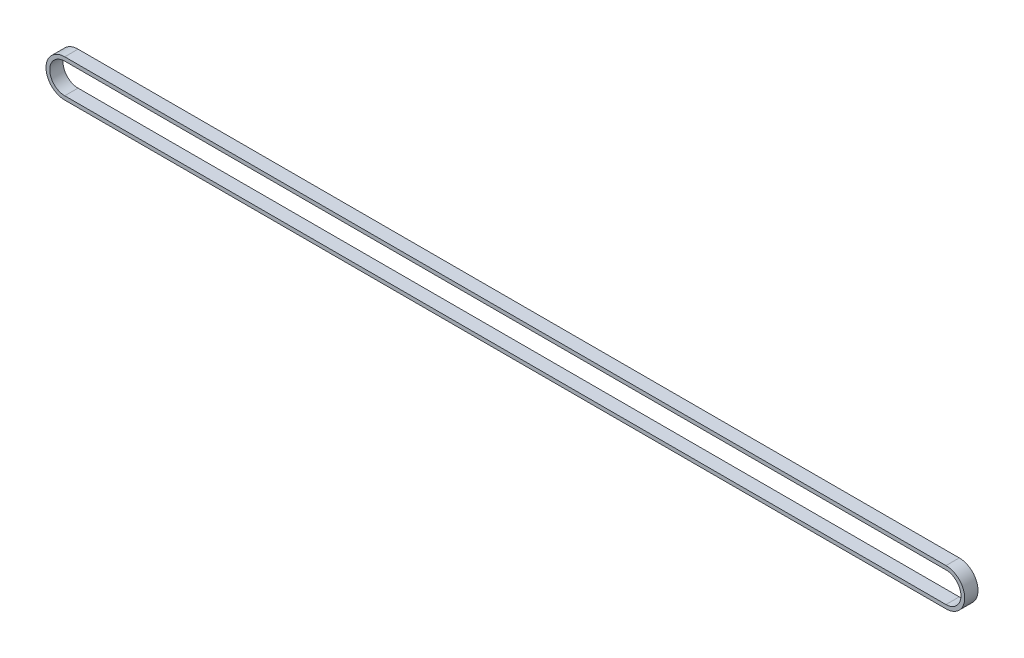
ISO-10303-21;
HEADER;
FILE_DESCRIPTION(('STEP AP214'),'2;1');
FILE_NAME('part.step','',(''),(''),'','','');
FILE_SCHEMA(('AUTOMOTIVE_DESIGN { 1 0 10303 214 1 1 1 1 }'));
ENDSEC;
DATA;
#1=APPLICATION_CONTEXT('core data for automotive mechanical design processes');
#2=APPLICATION_PROTOCOL_DEFINITION('international standard','automotive_design',2000,#1);
#3=PRODUCT_CONTEXT('',#1,'mechanical');
#4=PRODUCT('Part','Part','',(#3));
#5=PRODUCT_RELATED_PRODUCT_CATEGORY('part','',(#4));
#6=PRODUCT_DEFINITION_FORMATION('','',#4);
#7=PRODUCT_DEFINITION_CONTEXT('part definition',#1,'design');
#8=PRODUCT_DEFINITION('design','',#6,#7);
#9=PRODUCT_DEFINITION_SHAPE('','',#8);
#10=(LENGTH_UNIT() NAMED_UNIT(*) SI_UNIT(.MILLI.,.METRE.));
#11=(NAMED_UNIT(*) PLANE_ANGLE_UNIT() SI_UNIT($,.RADIAN.));
#12=(NAMED_UNIT(*) SI_UNIT($,.STERADIAN.) SOLID_ANGLE_UNIT());
#13=UNCERTAINTY_MEASURE_WITH_UNIT(LENGTH_MEASURE(1.E-05),#10,'distance_accuracy_value','');
#14=(GEOMETRIC_REPRESENTATION_CONTEXT(3) GLOBAL_UNCERTAINTY_ASSIGNED_CONTEXT((#13)) GLOBAL_UNIT_ASSIGNED_CONTEXT((#10,
#11,#12)) REPRESENTATION_CONTEXT('',''));
#15=CARTESIAN_POINT('',(0.,0.,0.));
#16=DIRECTION('',(0.,0.,1.));
#17=DIRECTION('',(1.,0.,0.));
#18=AXIS2_PLACEMENT_3D('',#15,#16,#17);
#19=CARTESIAN_POINT('',(-298.45,0.,4.5));
#20=DIRECTION('',(0.,0.,1.));
#21=DIRECTION('',(1.,0.,0.));
#22=AXIS2_PLACEMENT_3D('',#19,#20,#21);
#23=PLANE('',#22);
#24=CARTESIAN_POINT('',(-298.45,0.,4.5));
#25=DIRECTION('',(0.,0.,1.));
#26=DIRECTION('',(1.,0.,0.));
#27=AXIS2_PLACEMENT_3D('',#24,#25,#26);
#28=CIRCLE('',#27,12.7);
#29=CARTESIAN_POINT('',(-298.45,12.7,4.5));
#30=VERTEX_POINT('',#29);
#31=CARTESIAN_POINT('',(-298.45,-12.7,4.5));
#32=VERTEX_POINT('',#31);
#33=EDGE_CURVE('E158',#30,#32,#28,.T.);
#34=ORIENTED_EDGE('',*,*,#33,.T.);
#35=DIRECTION('',(1.,0.,0.));
#36=VECTOR('',#35,1.);
#37=CARTESIAN_POINT('',(-298.45,-12.7,4.5));
#38=LINE('',#37,#36);
#39=CARTESIAN_POINT('',(298.45,-12.7,4.5));
#40=VERTEX_POINT('',#39);
#41=EDGE_CURVE('E161',#32,#40,#38,.T.);
#42=ORIENTED_EDGE('',*,*,#41,.T.);
#43=CARTESIAN_POINT('',(298.45,0.,4.5));
#44=DIRECTION('',(0.,0.,1.));
#45=DIRECTION('',(1.,0.,0.));
#46=AXIS2_PLACEMENT_3D('',#43,#44,#45);
#47=CIRCLE('',#46,12.7);
#48=CARTESIAN_POINT('',(298.45,12.7,4.5));
#49=VERTEX_POINT('',#48);
#50=EDGE_CURVE('E164',#40,#49,#47,.T.);
#51=ORIENTED_EDGE('',*,*,#50,.T.);
#52=DIRECTION('',(-1.,0.,0.));
#53=VECTOR('',#52,1.);
#54=CARTESIAN_POINT('',(-298.45,12.7,4.5));
#55=LINE('',#54,#53);
#56=EDGE_CURVE('E166',#49,#30,#55,.T.);
#57=ORIENTED_EDGE('',*,*,#56,.T.);
#58=EDGE_LOOP('',(#34,#42,#51,#57));
#59=FACE_BOUND('',#58,.T.);
#60=DIRECTION('',(1.,0.,0.));
#61=VECTOR('',#60,1.);
#62=CARTESIAN_POINT('',(-298.45,-10.16,4.5));
#63=LINE('',#62,#61);
#64=CARTESIAN_POINT('',(-298.45,-10.16,4.5));
#65=VERTEX_POINT('',#64);
#66=CARTESIAN_POINT('',(298.45,-10.16,4.5));
#67=VERTEX_POINT('',#66);
#68=EDGE_CURVE('E130',#65,#67,#63,.T.);
#69=ORIENTED_EDGE('',*,*,#68,.F.);
#70=CARTESIAN_POINT('',(-298.45,0.,4.5));
#71=DIRECTION('',(0.,0.,1.));
#72=DIRECTION('',(1.,0.,0.));
#73=AXIS2_PLACEMENT_3D('',#70,#71,#72);
#74=CIRCLE('',#73,10.16);
#75=CARTESIAN_POINT('',(-298.45,10.16,4.5));
#76=VERTEX_POINT('',#75);
#77=EDGE_CURVE('E122',#76,#65,#74,.T.);
#78=ORIENTED_EDGE('',*,*,#77,.F.);
#79=DIRECTION('',(-1.,0.,0.));
#80=VECTOR('',#79,1.);
#81=CARTESIAN_POINT('',(-298.45,10.16,4.5));
#82=LINE('',#81,#80);
#83=CARTESIAN_POINT('',(298.45,10.16,4.5));
#84=VERTEX_POINT('',#83);
#85=EDGE_CURVE('E144',#84,#76,#82,.T.);
#86=ORIENTED_EDGE('',*,*,#85,.F.);
#87=CARTESIAN_POINT('',(298.45,0.,4.5));
#88=DIRECTION('',(0.,0.,1.));
#89=DIRECTION('',(1.,0.,0.));
#90=AXIS2_PLACEMENT_3D('',#87,#88,#89);
#91=CIRCLE('',#90,10.16);
#92=EDGE_CURVE('E142',#67,#84,#91,.T.);
#93=ORIENTED_EDGE('',*,*,#92,.F.);
#94=EDGE_LOOP('',(#69,#78,#86,#93));
#95=FACE_BOUND('',#94,.T.);
#96=ADVANCED_FACE('F57',(#59,#95),#23,.T.);
#97=CARTESIAN_POINT('',(-298.45,0.,-4.5));
#98=DIRECTION('',(0.,0.,1.));
#99=DIRECTION('',(1.,0.,0.));
#100=AXIS2_PLACEMENT_3D('',#97,#98,#99);
#101=PLANE('',#100);
#102=CARTESIAN_POINT('',(-298.45,0.,-4.5));
#103=DIRECTION('',(0.,0.,1.));
#104=DIRECTION('',(1.,0.,0.));
#105=AXIS2_PLACEMENT_3D('',#102,#103,#104);
#106=CIRCLE('',#105,12.7);
#107=CARTESIAN_POINT('',(-298.45,12.7,-4.5));
#108=VERTEX_POINT('',#107);
#109=CARTESIAN_POINT('',(-298.45,-12.7,-4.5));
#110=VERTEX_POINT('',#109);
#111=EDGE_CURVE('E138',#108,#110,#106,.T.);
#112=ORIENTED_EDGE('',*,*,#111,.F.);
#113=DIRECTION('',(-1.,0.,0.));
#114=VECTOR('',#113,1.);
#115=CARTESIAN_POINT('',(-298.45,12.7,-4.5));
#116=LINE('',#115,#114);
#117=CARTESIAN_POINT('',(298.45,12.7,-4.5));
#118=VERTEX_POINT('',#117);
#119=EDGE_CURVE('E162',#118,#108,#116,.T.);
#120=ORIENTED_EDGE('',*,*,#119,.F.);
#121=CARTESIAN_POINT('',(298.45,0.,-4.5));
#122=DIRECTION('',(0.,0.,1.));
#123=DIRECTION('',(1.,0.,0.));
#124=AXIS2_PLACEMENT_3D('',#121,#122,#123);
#125=CIRCLE('',#124,12.7);
#126=CARTESIAN_POINT('',(298.45,-12.7,-4.5));
#127=VERTEX_POINT('',#126);
#128=EDGE_CURVE('E173',#127,#118,#125,.T.);
#129=ORIENTED_EDGE('',*,*,#128,.F.);
#130=DIRECTION('',(1.,0.,0.));
#131=VECTOR('',#130,1.);
#132=CARTESIAN_POINT('',(-298.45,-12.7,-4.5));
#133=LINE('',#132,#131);
#134=EDGE_CURVE('E171',#110,#127,#133,.T.);
#135=ORIENTED_EDGE('',*,*,#134,.F.);
#136=EDGE_LOOP('',(#112,#120,#129,#135));
#137=FACE_BOUND('',#136,.T.);
#138=CARTESIAN_POINT('',(-298.45,0.,-4.5));
#139=DIRECTION('',(0.,0.,1.));
#140=DIRECTION('',(1.,0.,0.));
#141=AXIS2_PLACEMENT_3D('',#138,#139,#140);
#142=CIRCLE('',#141,10.16);
#143=CARTESIAN_POINT('',(-298.45,10.16,-4.5));
#144=VERTEX_POINT('',#143);
#145=CARTESIAN_POINT('',(-298.45,-10.16,-4.5));
#146=VERTEX_POINT('',#145);
#147=EDGE_CURVE('E80',#144,#146,#142,.T.);
#148=ORIENTED_EDGE('',*,*,#147,.T.);
#149=DIRECTION('',(1.,0.,0.));
#150=VECTOR('',#149,1.);
#151=CARTESIAN_POINT('',(-298.45,-10.16,-4.5));
#152=LINE('',#151,#150);
#153=CARTESIAN_POINT('',(298.45,-10.16,-4.5));
#154=VERTEX_POINT('',#153);
#155=EDGE_CURVE('E137',#146,#154,#152,.T.);
#156=ORIENTED_EDGE('',*,*,#155,.T.);
#157=CARTESIAN_POINT('',(298.45,0.,-4.5));
#158=DIRECTION('',(0.,0.,1.));
#159=DIRECTION('',(1.,0.,0.));
#160=AXIS2_PLACEMENT_3D('',#157,#158,#159);
#161=CIRCLE('',#160,10.16);
#162=CARTESIAN_POINT('',(298.45,10.16,-4.5));
#163=VERTEX_POINT('',#162);
#164=EDGE_CURVE('E150',#154,#163,#161,.T.);
#165=ORIENTED_EDGE('',*,*,#164,.T.);
#166=DIRECTION('',(-1.,0.,0.));
#167=VECTOR('',#166,1.);
#168=CARTESIAN_POINT('',(-298.45,10.16,-4.5));
#169=LINE('',#168,#167);
#170=EDGE_CURVE('E131',#163,#144,#169,.T.);
#171=ORIENTED_EDGE('',*,*,#170,.T.);
#172=EDGE_LOOP('',(#148,#156,#165,#171));
#173=FACE_BOUND('',#172,.T.);
#174=ADVANCED_FACE('F191',(#137,#173),#101,.F.);
#175=CARTESIAN_POINT('',(-298.45,0.,4.5));
#176=DIRECTION('',(0.,0.,-1.));
#177=DIRECTION('',(-1.,0.,0.));
#178=AXIS2_PLACEMENT_3D('',#175,#176,#177);
#179=CYLINDRICAL_SURFACE('',#178,12.7);
#180=ORIENTED_EDGE('',*,*,#111,.T.);
#181=DIRECTION('',(0.,0.,-1.));
#182=VECTOR('',#181,1.);
#183=CARTESIAN_POINT('',(-298.45,-12.7,4.5));
#184=LINE('',#183,#182);
#185=EDGE_CURVE('E12',#32,#110,#184,.T.);
#186=ORIENTED_EDGE('',*,*,#185,.F.);
#187=ORIENTED_EDGE('',*,*,#33,.F.);
#188=DIRECTION('',(0.,0.,-1.));
#189=VECTOR('',#188,1.);
#190=CARTESIAN_POINT('',(-298.45,12.7,4.5));
#191=LINE('',#190,#189);
#192=EDGE_CURVE('E168',#30,#108,#191,.T.);
#193=ORIENTED_EDGE('',*,*,#192,.T.);
#194=EDGE_LOOP('',(#180,#186,#187,#193));
#195=FACE_BOUND('',#194,.T.);
#196=ADVANCED_FACE('F59',(#195),#179,.T.);
#197=CARTESIAN_POINT('',(-298.45,-12.7,4.5));
#198=DIRECTION('',(0.,1.,0.));
#199=DIRECTION('',(0.,0.,1.));
#200=AXIS2_PLACEMENT_3D('',#197,#198,#199);
#201=PLANE('',#200);
#202=ORIENTED_EDGE('',*,*,#134,.T.);
#203=DIRECTION('',(0.,0.,-1.));
#204=VECTOR('',#203,1.);
#205=CARTESIAN_POINT('',(298.45,-12.7,4.5));
#206=LINE('',#205,#204);
#207=EDGE_CURVE('E65',#40,#127,#206,.T.);
#208=ORIENTED_EDGE('',*,*,#207,.F.);
#209=ORIENTED_EDGE('',*,*,#41,.F.);
#210=ORIENTED_EDGE('',*,*,#185,.T.);
#211=EDGE_LOOP('',(#202,#208,#209,#210));
#212=FACE_BOUND('',#211,.T.);
#213=ADVANCED_FACE('F201',(#212),#201,.F.);
#214=CARTESIAN_POINT('',(298.45,0.,4.5));
#215=DIRECTION('',(0.,0.,-1.));
#216=DIRECTION('',(-1.,0.,0.));
#217=AXIS2_PLACEMENT_3D('',#214,#215,#216);
#218=CYLINDRICAL_SURFACE('',#217,12.7);
#219=ORIENTED_EDGE('',*,*,#128,.T.);
#220=DIRECTION('',(0.,0.,-1.));
#221=VECTOR('',#220,1.);
#222=CARTESIAN_POINT('',(298.45,12.7,4.5));
#223=LINE('',#222,#221);
#224=EDGE_CURVE('E178',#49,#118,#223,.T.);
#225=ORIENTED_EDGE('',*,*,#224,.F.);
#226=ORIENTED_EDGE('',*,*,#50,.F.);
#227=ORIENTED_EDGE('',*,*,#207,.T.);
#228=EDGE_LOOP('',(#219,#225,#226,#227));
#229=FACE_BOUND('',#228,.T.);
#230=ADVANCED_FACE('F185',(#229),#218,.T.);
#231=CARTESIAN_POINT('',(-298.45,12.7,4.5));
#232=DIRECTION('',(0.,-1.,0.));
#233=DIRECTION('',(0.,0.,-1.));
#234=AXIS2_PLACEMENT_3D('',#231,#232,#233);
#235=PLANE('',#234);
#236=ORIENTED_EDGE('',*,*,#119,.T.);
#237=ORIENTED_EDGE('',*,*,#192,.F.);
#238=ORIENTED_EDGE('',*,*,#56,.F.);
#239=ORIENTED_EDGE('',*,*,#224,.T.);
#240=EDGE_LOOP('',(#236,#237,#238,#239));
#241=FACE_BOUND('',#240,.T.);
#242=ADVANCED_FACE('F195',(#241),#235,.F.);
#243=CARTESIAN_POINT('',(-298.45,0.,4.5));
#244=DIRECTION('',(0.,0.,-1.));
#245=DIRECTION('',(-1.,0.,0.));
#246=AXIS2_PLACEMENT_3D('',#243,#244,#245);
#247=CYLINDRICAL_SURFACE('',#246,10.16);
#248=ORIENTED_EDGE('',*,*,#147,.F.);
#249=DIRECTION('',(0.,0.,-1.));
#250=VECTOR('',#249,1.);
#251=CARTESIAN_POINT('',(-298.45,10.16,4.5));
#252=LINE('',#251,#250);
#253=EDGE_CURVE('E126',#76,#144,#252,.T.);
#254=ORIENTED_EDGE('',*,*,#253,.F.);
#255=ORIENTED_EDGE('',*,*,#77,.T.);
#256=DIRECTION('',(0.,0.,-1.));
#257=VECTOR('',#256,1.);
#258=CARTESIAN_POINT('',(-298.45,-10.16,4.5));
#259=LINE('',#258,#257);
#260=EDGE_CURVE('E125',#65,#146,#259,.T.);
#261=ORIENTED_EDGE('',*,*,#260,.T.);
#262=EDGE_LOOP('',(#248,#254,#255,#261));
#263=FACE_BOUND('',#262,.T.);
#264=ADVANCED_FACE('F124',(#263),#247,.F.);
#265=CARTESIAN_POINT('',(-298.45,-10.16,4.5));
#266=DIRECTION('',(0.,1.,0.));
#267=DIRECTION('',(0.,0.,1.));
#268=AXIS2_PLACEMENT_3D('',#265,#266,#267);
#269=PLANE('',#268);
#270=ORIENTED_EDGE('',*,*,#155,.F.);
#271=ORIENTED_EDGE('',*,*,#260,.F.);
#272=ORIENTED_EDGE('',*,*,#68,.T.);
#273=DIRECTION('',(0.,0.,-1.));
#274=VECTOR('',#273,1.);
#275=CARTESIAN_POINT('',(298.45,-10.16,4.5));
#276=LINE('',#275,#274);
#277=EDGE_CURVE('E139',#67,#154,#276,.T.);
#278=ORIENTED_EDGE('',*,*,#277,.T.);
#279=EDGE_LOOP('',(#270,#271,#272,#278));
#280=FACE_BOUND('',#279,.T.);
#281=ADVANCED_FACE('F134',(#280),#269,.T.);
#282=CARTESIAN_POINT('',(298.45,0.,4.5));
#283=DIRECTION('',(0.,0.,-1.));
#284=DIRECTION('',(-1.,0.,0.));
#285=AXIS2_PLACEMENT_3D('',#282,#283,#284);
#286=CYLINDRICAL_SURFACE('',#285,10.16);
#287=ORIENTED_EDGE('',*,*,#164,.F.);
#288=ORIENTED_EDGE('',*,*,#277,.F.);
#289=ORIENTED_EDGE('',*,*,#92,.T.);
#290=DIRECTION('',(0.,0.,-1.));
#291=VECTOR('',#290,1.);
#292=CARTESIAN_POINT('',(298.45,10.16,4.5));
#293=LINE('',#292,#291);
#294=EDGE_CURVE('E72',#84,#163,#293,.T.);
#295=ORIENTED_EDGE('',*,*,#294,.T.);
#296=EDGE_LOOP('',(#287,#288,#289,#295));
#297=FACE_BOUND('',#296,.T.);
#298=ADVANCED_FACE('F224',(#297),#286,.F.);
#299=CARTESIAN_POINT('',(-298.45,10.16,4.5));
#300=DIRECTION('',(0.,-1.,0.));
#301=DIRECTION('',(0.,0.,-1.));
#302=AXIS2_PLACEMENT_3D('',#299,#300,#301);
#303=PLANE('',#302);
#304=ORIENTED_EDGE('',*,*,#170,.F.);
#305=ORIENTED_EDGE('',*,*,#294,.F.);
#306=ORIENTED_EDGE('',*,*,#85,.T.);
#307=ORIENTED_EDGE('',*,*,#253,.T.);
#308=EDGE_LOOP('',(#304,#305,#306,#307));
#309=FACE_BOUND('',#308,.T.);
#310=ADVANCED_FACE('F228',(#309),#303,.T.);
#311=CLOSED_SHELL('',(#96,#174,#196,#213,#230,#242,#264,#281,#298,#310));
#312=MANIFOLD_SOLID_BREP('B2',#311);
#313=ADVANCED_BREP_SHAPE_REPRESENTATION('',(#18,#312),#14);
#314=SHAPE_DEFINITION_REPRESENTATION(#9,#313);
ENDSEC;
END-ISO-10303-21;
